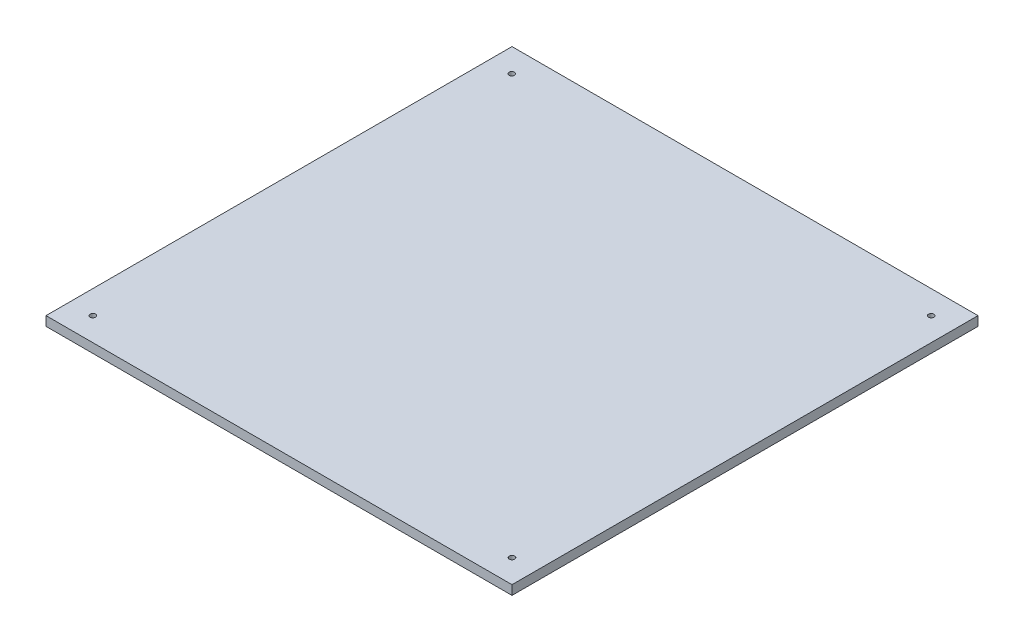
ISO-10303-21;
HEADER;
FILE_DESCRIPTION(('STEP AP214'),'2;1');
FILE_NAME('part.step','',(''),(''),'','','');
FILE_SCHEMA(('AUTOMOTIVE_DESIGN { 1 0 10303 214 1 1 1 1 }'));
ENDSEC;
DATA;
#1=APPLICATION_CONTEXT('core data for automotive mechanical design processes');
#2=APPLICATION_PROTOCOL_DEFINITION('international standard','automotive_design',2000,#1);
#3=PRODUCT_CONTEXT('',#1,'mechanical');
#4=PRODUCT('Part','Part','',(#3));
#5=PRODUCT_RELATED_PRODUCT_CATEGORY('part','',(#4));
#6=PRODUCT_DEFINITION_FORMATION('','',#4);
#7=PRODUCT_DEFINITION_CONTEXT('part definition',#1,'design');
#8=PRODUCT_DEFINITION('design','',#6,#7);
#9=PRODUCT_DEFINITION_SHAPE('','',#8);
#10=(LENGTH_UNIT() NAMED_UNIT(*) SI_UNIT(.MILLI.,.METRE.));
#11=(NAMED_UNIT(*) PLANE_ANGLE_UNIT() SI_UNIT($,.RADIAN.));
#12=(NAMED_UNIT(*) SI_UNIT($,.STERADIAN.) SOLID_ANGLE_UNIT());
#13=UNCERTAINTY_MEASURE_WITH_UNIT(LENGTH_MEASURE(1.E-05),#10,'distance_accuracy_value','');
#14=(GEOMETRIC_REPRESENTATION_CONTEXT(3) GLOBAL_UNCERTAINTY_ASSIGNED_CONTEXT((#13)) GLOBAL_UNIT_ASSIGNED_CONTEXT((#10,
#11,#12)) REPRESENTATION_CONTEXT('',''));
#15=CARTESIAN_POINT('',(0.,0.,0.));
#16=DIRECTION('',(0.,0.,1.));
#17=DIRECTION('',(1.,0.,0.));
#18=AXIS2_PLACEMENT_3D('',#15,#16,#17);
#19=CARTESIAN_POINT('',(-71.374392739327,6.,-257.505441410546));
#20=DIRECTION('',(1.,0.,0.));
#21=DIRECTION('',(0.,0.,-1.));
#22=AXIS2_PLACEMENT_3D('',#19,#20,#21);
#23=PLANE('',#22);
#24=DIRECTION('',(0.,0.,1.));
#25=VECTOR('',#24,1.);
#26=CARTESIAN_POINT('',(-71.374392739327,0.,-257.505441410546));
#27=LINE('',#26,#25);
#28=CARTESIAN_POINT('',(-71.374392739327,0.,-257.505441410546));
#29=VERTEX_POINT('',#28);
#30=CARTESIAN_POINT('',(-71.374392739327,0.,42.4945585894544));
#31=VERTEX_POINT('',#30);
#32=EDGE_CURVE('E105',#29,#31,#27,.T.);
#33=ORIENTED_EDGE('',*,*,#32,.T.);
#34=DIRECTION('',(0.,-1.,0.));
#35=VECTOR('',#34,1.);
#36=CARTESIAN_POINT('',(-71.374392739327,6.,42.4945585894544));
#37=LINE('',#36,#35);
#38=CARTESIAN_POINT('',(-71.374392739327,6.,42.4945585894544));
#39=VERTEX_POINT('',#38);
#40=EDGE_CURVE('E11',#39,#31,#37,.T.);
#41=ORIENTED_EDGE('',*,*,#40,.F.);
#42=DIRECTION('',(0.,0.,1.));
#43=VECTOR('',#42,1.);
#44=CARTESIAN_POINT('',(-71.374392739327,6.,-257.505441410546));
#45=LINE('',#44,#43);
#46=CARTESIAN_POINT('',(-71.374392739327,6.,-257.505441410546));
#47=VERTEX_POINT('',#46);
#48=EDGE_CURVE('E93',#47,#39,#45,.T.);
#49=ORIENTED_EDGE('',*,*,#48,.F.);
#50=DIRECTION('',(0.,-1.,0.));
#51=VECTOR('',#50,1.);
#52=CARTESIAN_POINT('',(-71.374392739327,6.,-257.505441410546));
#53=LINE('',#52,#51);
#54=EDGE_CURVE('E101',#47,#29,#53,.T.);
#55=ORIENTED_EDGE('',*,*,#54,.T.);
#56=EDGE_LOOP('',(#33,#41,#49,#55));
#57=FACE_BOUND('',#56,.T.);
#58=ADVANCED_FACE('F42',(#57),#23,.F.);
#59=CARTESIAN_POINT('',(-71.374392739327,6.,42.4945585894544));
#60=DIRECTION('',(0.,0.,-1.));
#61=DIRECTION('',(-1.,0.,0.));
#62=AXIS2_PLACEMENT_3D('',#59,#60,#61);
#63=PLANE('',#62);
#64=DIRECTION('',(1.,0.,0.));
#65=VECTOR('',#64,1.);
#66=CARTESIAN_POINT('',(-71.374392739327,0.,42.4945585894544));
#67=LINE('',#66,#65);
#68=CARTESIAN_POINT('',(228.625607260673,0.,42.4945585894544));
#69=VERTEX_POINT('',#68);
#70=EDGE_CURVE('E97',#31,#69,#67,.T.);
#71=ORIENTED_EDGE('',*,*,#70,.T.);
#72=DIRECTION('',(0.,-1.,0.));
#73=VECTOR('',#72,1.);
#74=CARTESIAN_POINT('',(228.625607260673,6.,42.4945585894544));
#75=LINE('',#74,#73);
#76=CARTESIAN_POINT('',(228.625607260673,6.,42.4945585894544));
#77=VERTEX_POINT('',#76);
#78=EDGE_CURVE('E50',#77,#69,#75,.T.);
#79=ORIENTED_EDGE('',*,*,#78,.F.);
#80=DIRECTION('',(1.,0.,0.));
#81=VECTOR('',#80,1.);
#82=CARTESIAN_POINT('',(-71.374392739327,6.,42.4945585894544));
#83=LINE('',#82,#81);
#84=EDGE_CURVE('E88',#39,#77,#83,.T.);
#85=ORIENTED_EDGE('',*,*,#84,.F.);
#86=ORIENTED_EDGE('',*,*,#40,.T.);
#87=EDGE_LOOP('',(#71,#79,#85,#86));
#88=FACE_BOUND('',#87,.T.);
#89=ADVANCED_FACE('F96',(#88),#63,.F.);
#90=CARTESIAN_POINT('',(228.625607260673,6.,-257.505441410546));
#91=DIRECTION('',(-1.,0.,0.));
#92=DIRECTION('',(0.,0.,1.));
#93=AXIS2_PLACEMENT_3D('',#90,#91,#92);
#94=PLANE('',#93);
#95=DIRECTION('',(0.,0.,-1.));
#96=VECTOR('',#95,1.);
#97=CARTESIAN_POINT('',(228.625607260673,0.,-257.505441410546));
#98=LINE('',#97,#96);
#99=CARTESIAN_POINT('',(228.625607260673,0.,-257.505441410546));
#100=VERTEX_POINT('',#99);
#101=EDGE_CURVE('E75',#69,#100,#98,.T.);
#102=ORIENTED_EDGE('',*,*,#101,.T.);
#103=DIRECTION('',(0.,-1.,0.));
#104=VECTOR('',#103,1.);
#105=CARTESIAN_POINT('',(228.625607260673,6.,-257.505441410546));
#106=LINE('',#105,#104);
#107=CARTESIAN_POINT('',(228.625607260673,6.,-257.505441410546));
#108=VERTEX_POINT('',#107);
#109=EDGE_CURVE('E98',#108,#100,#106,.T.);
#110=ORIENTED_EDGE('',*,*,#109,.F.);
#111=DIRECTION('',(0.,0.,-1.));
#112=VECTOR('',#111,1.);
#113=CARTESIAN_POINT('',(228.625607260673,6.,-257.505441410546));
#114=LINE('',#113,#112);
#115=EDGE_CURVE('E91',#77,#108,#114,.T.);
#116=ORIENTED_EDGE('',*,*,#115,.F.);
#117=ORIENTED_EDGE('',*,*,#78,.T.);
#118=EDGE_LOOP('',(#102,#110,#116,#117));
#119=FACE_BOUND('',#118,.T.);
#120=ADVANCED_FACE('F99',(#119),#94,.F.);
#121=CARTESIAN_POINT('',(-71.374392739327,6.,-257.505441410546));
#122=DIRECTION('',(0.,0.,1.));
#123=DIRECTION('',(1.,0.,0.));
#124=AXIS2_PLACEMENT_3D('',#121,#122,#123);
#125=PLANE('',#124);
#126=DIRECTION('',(-1.,0.,0.));
#127=VECTOR('',#126,1.);
#128=CARTESIAN_POINT('',(-71.374392739327,0.,-257.505441410546));
#129=LINE('',#128,#127);
#130=EDGE_CURVE('E81',#100,#29,#129,.T.);
#131=ORIENTED_EDGE('',*,*,#130,.T.);
#132=ORIENTED_EDGE('',*,*,#54,.F.);
#133=DIRECTION('',(-1.,0.,0.));
#134=VECTOR('',#133,1.);
#135=CARTESIAN_POINT('',(-71.374392739327,6.,-257.505441410546));
#136=LINE('',#135,#134);
#137=EDGE_CURVE('E58',#108,#47,#136,.T.);
#138=ORIENTED_EDGE('',*,*,#137,.F.);
#139=ORIENTED_EDGE('',*,*,#109,.T.);
#140=EDGE_LOOP('',(#131,#132,#138,#139));
#141=FACE_BOUND('',#140,.T.);
#142=ADVANCED_FACE('F113',(#141),#125,.F.);
#143=CARTESIAN_POINT('',(0.,6.,0.));
#144=DIRECTION('',(0.,1.,0.));
#145=DIRECTION('',(0.,0.,1.));
#146=AXIS2_PLACEMENT_3D('',#143,#144,#145);
#147=PLANE('',#146);
#148=CARTESIAN_POINT('',(-56.2884284978826,6.,27.4279454120959));
#149=DIRECTION('',(0.,1.,0.));
#150=DIRECTION('',(0.,0.,1.));
#151=AXIS2_PLACEMENT_3D('',#148,#149,#150);
#152=CIRCLE('',#151,1.75);
#153=CARTESIAN_POINT('',(-56.2884284978826,6.,29.1779454120959));
#154=VERTEX_POINT('',#153);
#155=EDGE_CURVE('E137',#154,#154,#152,.T.);
#156=ORIENTED_EDGE('',*,*,#155,.F.);
#157=EDGE_LOOP('',(#156));
#158=FACE_BOUND('',#157,.T.);
#159=CARTESIAN_POINT('',(213.595187270257,6.,-242.43684506576));
#160=DIRECTION('',(0.,1.,0.));
#161=DIRECTION('',(0.,0.,1.));
#162=AXIS2_PLACEMENT_3D('',#159,#160,#161);
#163=CIRCLE('',#162,1.75000000000001);
#164=CARTESIAN_POINT('',(213.595187270257,6.,-240.68684506576));
#165=VERTEX_POINT('',#164);
#166=EDGE_CURVE('E131',#165,#165,#163,.T.);
#167=ORIENTED_EDGE('',*,*,#166,.F.);
#168=EDGE_LOOP('',(#167));
#169=FACE_BOUND('',#168,.T.);
#170=CARTESIAN_POINT('',(213.51745093393,6.,27.406864843819));
#171=DIRECTION('',(0.,1.,0.));
#172=DIRECTION('',(0.,0.,1.));
#173=AXIS2_PLACEMENT_3D('',#170,#171,#172);
#174=CIRCLE('',#173,1.75000000000001);
#175=CARTESIAN_POINT('',(213.51745093393,6.,29.156864843819));
#176=VERTEX_POINT('',#175);
#177=EDGE_CURVE('E125',#176,#176,#174,.T.);
#178=ORIENTED_EDGE('',*,*,#177,.F.);
#179=EDGE_LOOP('',(#178));
#180=FACE_BOUND('',#179,.T.);
#181=CARTESIAN_POINT('',(-56.304099694284,6.,-242.248751527662));
#182=DIRECTION('',(0.,1.,0.));
#183=DIRECTION('',(0.,0.,1.));
#184=AXIS2_PLACEMENT_3D('',#181,#182,#183);
#185=CIRCLE('',#184,1.75000000000001);
#186=CARTESIAN_POINT('',(-56.304099694284,6.,-240.498751527662));
#187=VERTEX_POINT('',#186);
#188=EDGE_CURVE('E119',#187,#187,#185,.T.);
#189=ORIENTED_EDGE('',*,*,#188,.F.);
#190=EDGE_LOOP('',(#189));
#191=FACE_BOUND('',#190,.T.);
#192=ORIENTED_EDGE('',*,*,#48,.T.);
#193=ORIENTED_EDGE('',*,*,#84,.T.);
#194=ORIENTED_EDGE('',*,*,#115,.T.);
#195=ORIENTED_EDGE('',*,*,#137,.T.);
#196=EDGE_LOOP('',(#192,#193,#194,#195));
#197=FACE_BOUND('',#196,.T.);
#198=ADVANCED_FACE('F89',(#158,#169,#180,#191,#197),#147,.T.);
#199=CARTESIAN_POINT('',(0.,0.,0.));
#200=DIRECTION('',(0.,1.,0.));
#201=DIRECTION('',(0.,0.,1.));
#202=AXIS2_PLACEMENT_3D('',#199,#200,#201);
#203=PLANE('',#202);
#204=CARTESIAN_POINT('',(-56.2884284978826,0.,27.4279454120959));
#205=DIRECTION('',(0.,1.,0.));
#206=DIRECTION('',(0.,0.,1.));
#207=AXIS2_PLACEMENT_3D('',#204,#205,#206);
#208=CIRCLE('',#207,1.75);
#209=CARTESIAN_POINT('',(-56.2884284978826,0.,29.1779454120959));
#210=VERTEX_POINT('',#209);
#211=EDGE_CURVE('E134',#210,#210,#208,.T.);
#212=ORIENTED_EDGE('',*,*,#211,.T.);
#213=EDGE_LOOP('',(#212));
#214=FACE_BOUND('',#213,.T.);
#215=CARTESIAN_POINT('',(213.595187270257,0.,-242.43684506576));
#216=DIRECTION('',(0.,1.,0.));
#217=DIRECTION('',(0.,0.,1.));
#218=AXIS2_PLACEMENT_3D('',#215,#216,#217);
#219=CIRCLE('',#218,1.75000000000001);
#220=CARTESIAN_POINT('',(213.595187270257,0.,-240.68684506576));
#221=VERTEX_POINT('',#220);
#222=EDGE_CURVE('E128',#221,#221,#219,.T.);
#223=ORIENTED_EDGE('',*,*,#222,.T.);
#224=EDGE_LOOP('',(#223));
#225=FACE_BOUND('',#224,.T.);
#226=CARTESIAN_POINT('',(213.51745093393,0.,27.406864843819));
#227=DIRECTION('',(0.,1.,0.));
#228=DIRECTION('',(0.,0.,1.));
#229=AXIS2_PLACEMENT_3D('',#226,#227,#228);
#230=CIRCLE('',#229,1.75000000000001);
#231=CARTESIAN_POINT('',(213.51745093393,0.,29.156864843819));
#232=VERTEX_POINT('',#231);
#233=EDGE_CURVE('E122',#232,#232,#230,.T.);
#234=ORIENTED_EDGE('',*,*,#233,.T.);
#235=EDGE_LOOP('',(#234));
#236=FACE_BOUND('',#235,.T.);
#237=CARTESIAN_POINT('',(-56.304099694284,0.,-242.248751527662));
#238=DIRECTION('',(0.,1.,0.));
#239=DIRECTION('',(0.,0.,1.));
#240=AXIS2_PLACEMENT_3D('',#237,#238,#239);
#241=CIRCLE('',#240,1.75000000000001);
#242=CARTESIAN_POINT('',(-56.304099694284,0.,-240.498751527662));
#243=VERTEX_POINT('',#242);
#244=EDGE_CURVE('E108',#243,#243,#241,.T.);
#245=ORIENTED_EDGE('',*,*,#244,.T.);
#246=EDGE_LOOP('',(#245));
#247=FACE_BOUND('',#246,.T.);
#248=ORIENTED_EDGE('',*,*,#32,.F.);
#249=ORIENTED_EDGE('',*,*,#130,.F.);
#250=ORIENTED_EDGE('',*,*,#101,.F.);
#251=ORIENTED_EDGE('',*,*,#70,.F.);
#252=EDGE_LOOP('',(#248,#249,#250,#251));
#253=FACE_BOUND('',#252,.T.);
#254=ADVANCED_FACE('F116',(#214,#225,#236,#247,#253),#203,.F.);
#255=CARTESIAN_POINT('',(-56.304099694284,0.,-242.248751527662));
#256=DIRECTION('',(0.,1.,0.));
#257=DIRECTION('',(0.,0.,1.));
#258=AXIS2_PLACEMENT_3D('',#255,#256,#257);
#259=CYLINDRICAL_SURFACE('',#258,1.75000000000001);
#260=ORIENTED_EDGE('',*,*,#244,.F.);
#261=EDGE_LOOP('',(#260));
#262=FACE_BOUND('',#261,.T.);
#263=ORIENTED_EDGE('',*,*,#188,.T.);
#264=EDGE_LOOP('',(#263));
#265=FACE_BOUND('',#264,.T.);
#266=ADVANCED_FACE('F161',(#262,#265),#259,.F.);
#267=CARTESIAN_POINT('',(213.51745093393,0.,27.406864843819));
#268=DIRECTION('',(0.,1.,0.));
#269=DIRECTION('',(0.,0.,1.));
#270=AXIS2_PLACEMENT_3D('',#267,#268,#269);
#271=CYLINDRICAL_SURFACE('',#270,1.75000000000001);
#272=ORIENTED_EDGE('',*,*,#233,.F.);
#273=EDGE_LOOP('',(#272));
#274=FACE_BOUND('',#273,.T.);
#275=ORIENTED_EDGE('',*,*,#177,.T.);
#276=EDGE_LOOP('',(#275));
#277=FACE_BOUND('',#276,.T.);
#278=ADVANCED_FACE('F163',(#274,#277),#271,.F.);
#279=CARTESIAN_POINT('',(213.595187270257,0.,-242.43684506576));
#280=DIRECTION('',(0.,1.,0.));
#281=DIRECTION('',(0.,0.,1.));
#282=AXIS2_PLACEMENT_3D('',#279,#280,#281);
#283=CYLINDRICAL_SURFACE('',#282,1.75000000000001);
#284=ORIENTED_EDGE('',*,*,#222,.F.);
#285=EDGE_LOOP('',(#284));
#286=FACE_BOUND('',#285,.T.);
#287=ORIENTED_EDGE('',*,*,#166,.T.);
#288=EDGE_LOOP('',(#287));
#289=FACE_BOUND('',#288,.T.);
#290=ADVANCED_FACE('F148',(#286,#289),#283,.F.);
#291=CARTESIAN_POINT('',(-56.2884284978826,0.,27.4279454120959));
#292=DIRECTION('',(0.,1.,0.));
#293=DIRECTION('',(0.,0.,1.));
#294=AXIS2_PLACEMENT_3D('',#291,#292,#293);
#295=CYLINDRICAL_SURFACE('',#294,1.75);
#296=ORIENTED_EDGE('',*,*,#211,.F.);
#297=EDGE_LOOP('',(#296));
#298=FACE_BOUND('',#297,.T.);
#299=ORIENTED_EDGE('',*,*,#155,.T.);
#300=EDGE_LOOP('',(#299));
#301=FACE_BOUND('',#300,.T.);
#302=ADVANCED_FACE('F145',(#298,#301),#295,.F.);
#303=CLOSED_SHELL('',(#58,#89,#120,#142,#198,#254,#266,#278,#290,#302));
#304=MANIFOLD_SOLID_BREP('B2',#303);
#305=ADVANCED_BREP_SHAPE_REPRESENTATION('',(#18,#304),#14);
#306=SHAPE_DEFINITION_REPRESENTATION(#9,#305);
ENDSEC;
END-ISO-10303-21;
